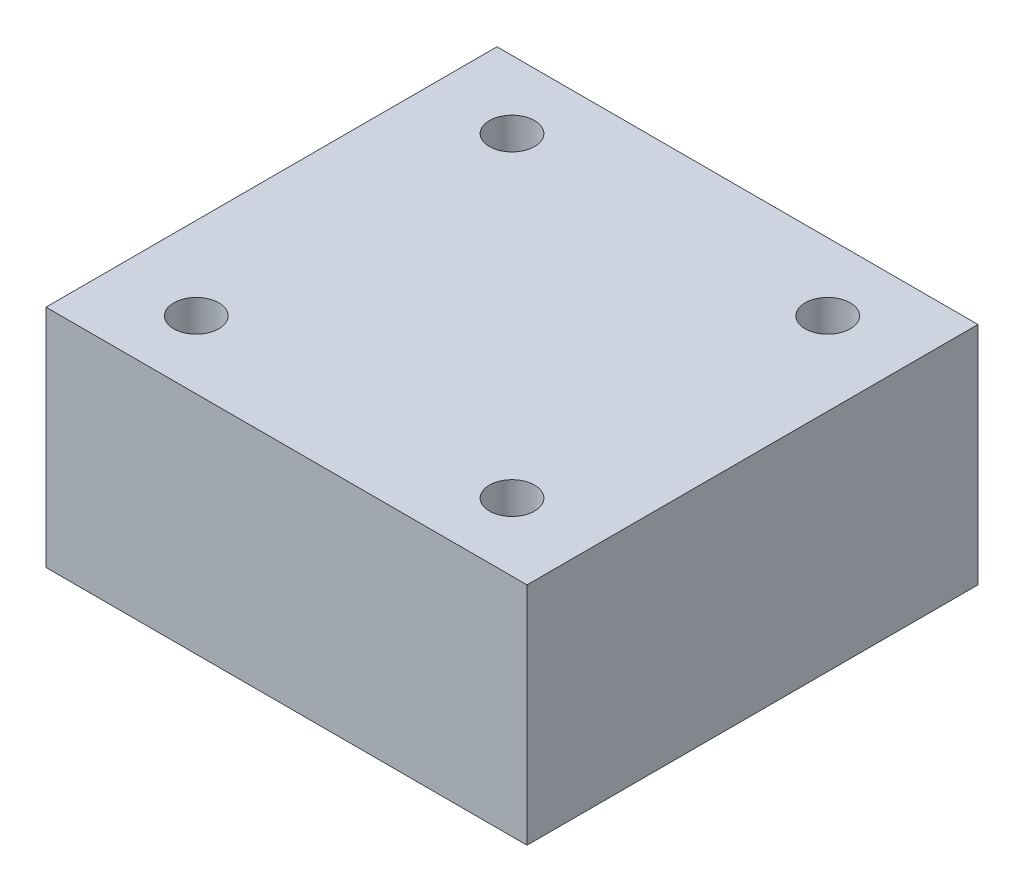
ISO-10303-21;
HEADER;
FILE_DESCRIPTION(('STEP AP214'),'2;1');
FILE_NAME('part.step','',(''),(''),'','','');
FILE_SCHEMA(('AUTOMOTIVE_DESIGN { 1 0 10303 214 1 1 1 1 }'));
ENDSEC;
DATA;
#1=APPLICATION_CONTEXT('core data for automotive mechanical design processes');
#2=APPLICATION_PROTOCOL_DEFINITION('international standard','automotive_design',2000,#1);
#3=PRODUCT_CONTEXT('',#1,'mechanical');
#4=PRODUCT('Part','Part','',(#3));
#5=PRODUCT_RELATED_PRODUCT_CATEGORY('part','',(#4));
#6=PRODUCT_DEFINITION_FORMATION('','',#4);
#7=PRODUCT_DEFINITION_CONTEXT('part definition',#1,'design');
#8=PRODUCT_DEFINITION('design','',#6,#7);
#9=PRODUCT_DEFINITION_SHAPE('','',#8);
#10=(LENGTH_UNIT() NAMED_UNIT(*) SI_UNIT(.MILLI.,.METRE.));
#11=(NAMED_UNIT(*) PLANE_ANGLE_UNIT() SI_UNIT($,.RADIAN.));
#12=(NAMED_UNIT(*) SI_UNIT($,.STERADIAN.) SOLID_ANGLE_UNIT());
#13=UNCERTAINTY_MEASURE_WITH_UNIT(LENGTH_MEASURE(1.E-05),#10,'distance_accuracy_value','');
#14=(GEOMETRIC_REPRESENTATION_CONTEXT(3) GLOBAL_UNCERTAINTY_ASSIGNED_CONTEXT((#13)) GLOBAL_UNIT_ASSIGNED_CONTEXT((#10,
#11,#12)) REPRESENTATION_CONTEXT('',''));
#15=CARTESIAN_POINT('',(0.,0.,0.));
#16=DIRECTION('',(0.,0.,1.));
#17=DIRECTION('',(1.,0.,0.));
#18=AXIS2_PLACEMENT_3D('',#15,#16,#17);
#19=CARTESIAN_POINT('',(0.,15.,0.));
#20=DIRECTION('',(1.,0.,0.));
#21=DIRECTION('',(0.,0.,-1.));
#22=AXIS2_PLACEMENT_3D('',#19,#20,#21);
#23=PLANE('',#22);
#24=DIRECTION('',(0.,0.,1.));
#25=VECTOR('',#24,1.);
#26=CARTESIAN_POINT('',(0.,0.,0.));
#27=LINE('',#26,#25);
#28=CARTESIAN_POINT('',(0.,0.,-30.));
#29=VERTEX_POINT('',#28);
#30=CARTESIAN_POINT('',(0.,0.,0.));
#31=VERTEX_POINT('',#30);
#32=EDGE_CURVE('E115',#29,#31,#27,.T.);
#33=ORIENTED_EDGE('',*,*,#32,.T.);
#34=DIRECTION('',(0.,-1.,0.));
#35=VECTOR('',#34,1.);
#36=CARTESIAN_POINT('',(0.,15.,0.));
#37=LINE('',#36,#35);
#38=CARTESIAN_POINT('',(0.,15.,0.));
#39=VERTEX_POINT('',#38);
#40=EDGE_CURVE('E11',#39,#31,#37,.T.);
#41=ORIENTED_EDGE('',*,*,#40,.F.);
#42=DIRECTION('',(0.,0.,1.));
#43=VECTOR('',#42,1.);
#44=CARTESIAN_POINT('',(0.,15.,0.));
#45=LINE('',#44,#43);
#46=CARTESIAN_POINT('',(0.,15.,-30.));
#47=VERTEX_POINT('',#46);
#48=EDGE_CURVE('E99',#47,#39,#45,.T.);
#49=ORIENTED_EDGE('',*,*,#48,.F.);
#50=DIRECTION('',(0.,-1.,0.));
#51=VECTOR('',#50,1.);
#52=CARTESIAN_POINT('',(0.,15.,-30.));
#53=LINE('',#52,#51);
#54=EDGE_CURVE('E111',#47,#29,#53,.T.);
#55=ORIENTED_EDGE('',*,*,#54,.T.);
#56=EDGE_LOOP('',(#33,#41,#49,#55));
#57=FACE_BOUND('',#56,.T.);
#58=ADVANCED_FACE('F47',(#57),#23,.F.);
#59=CARTESIAN_POINT('',(0.,15.,0.));
#60=DIRECTION('',(0.,0.,-1.));
#61=DIRECTION('',(-1.,0.,0.));
#62=AXIS2_PLACEMENT_3D('',#59,#60,#61);
#63=PLANE('',#62);
#64=DIRECTION('',(1.,0.,0.));
#65=VECTOR('',#64,1.);
#66=CARTESIAN_POINT('',(0.,0.,0.));
#67=LINE('',#66,#65);
#68=CARTESIAN_POINT('',(32.,0.,0.));
#69=VERTEX_POINT('',#68);
#70=EDGE_CURVE('E104',#31,#69,#67,.T.);
#71=ORIENTED_EDGE('',*,*,#70,.T.);
#72=DIRECTION('',(0.,-1.,0.));
#73=VECTOR('',#72,1.);
#74=CARTESIAN_POINT('',(32.,15.,0.));
#75=LINE('',#74,#73);
#76=CARTESIAN_POINT('',(32.,15.,0.));
#77=VERTEX_POINT('',#76);
#78=EDGE_CURVE('E56',#77,#69,#75,.T.);
#79=ORIENTED_EDGE('',*,*,#78,.F.);
#80=DIRECTION('',(1.,0.,0.));
#81=VECTOR('',#80,1.);
#82=CARTESIAN_POINT('',(0.,15.,0.));
#83=LINE('',#82,#81);
#84=EDGE_CURVE('E94',#39,#77,#83,.T.);
#85=ORIENTED_EDGE('',*,*,#84,.F.);
#86=ORIENTED_EDGE('',*,*,#40,.T.);
#87=EDGE_LOOP('',(#71,#79,#85,#86));
#88=FACE_BOUND('',#87,.T.);
#89=ADVANCED_FACE('F103',(#88),#63,.F.);
#90=CARTESIAN_POINT('',(32.,15.,0.));
#91=DIRECTION('',(-1.,0.,0.));
#92=DIRECTION('',(0.,0.,1.));
#93=AXIS2_PLACEMENT_3D('',#90,#91,#92);
#94=PLANE('',#93);
#95=DIRECTION('',(0.,0.,-1.));
#96=VECTOR('',#95,1.);
#97=CARTESIAN_POINT('',(32.,0.,0.));
#98=LINE('',#97,#96);
#99=CARTESIAN_POINT('',(32.,0.,-30.));
#100=VERTEX_POINT('',#99);
#101=EDGE_CURVE('E81',#69,#100,#98,.T.);
#102=ORIENTED_EDGE('',*,*,#101,.T.);
#103=DIRECTION('',(0.,-1.,0.));
#104=VECTOR('',#103,1.);
#105=CARTESIAN_POINT('',(32.,15.,-30.));
#106=LINE('',#105,#104);
#107=CARTESIAN_POINT('',(32.,15.,-30.));
#108=VERTEX_POINT('',#107);
#109=EDGE_CURVE('E106',#108,#100,#106,.T.);
#110=ORIENTED_EDGE('',*,*,#109,.F.);
#111=DIRECTION('',(0.,0.,-1.));
#112=VECTOR('',#111,1.);
#113=CARTESIAN_POINT('',(32.,15.,0.));
#114=LINE('',#113,#112);
#115=EDGE_CURVE('E97',#77,#108,#114,.T.);
#116=ORIENTED_EDGE('',*,*,#115,.F.);
#117=ORIENTED_EDGE('',*,*,#78,.T.);
#118=EDGE_LOOP('',(#102,#110,#116,#117));
#119=FACE_BOUND('',#118,.T.);
#120=ADVANCED_FACE('F107',(#119),#94,.F.);
#121=CARTESIAN_POINT('',(0.,15.,-30.));
#122=DIRECTION('',(0.,0.,1.));
#123=DIRECTION('',(1.,0.,0.));
#124=AXIS2_PLACEMENT_3D('',#121,#122,#123);
#125=PLANE('',#124);
#126=DIRECTION('',(-1.,0.,0.));
#127=VECTOR('',#126,1.);
#128=CARTESIAN_POINT('',(0.,0.,-30.));
#129=LINE('',#128,#127);
#130=EDGE_CURVE('E87',#100,#29,#129,.T.);
#131=ORIENTED_EDGE('',*,*,#130,.T.);
#132=ORIENTED_EDGE('',*,*,#54,.F.);
#133=DIRECTION('',(-1.,0.,0.));
#134=VECTOR('',#133,1.);
#135=CARTESIAN_POINT('',(0.,15.,-30.));
#136=LINE('',#135,#134);
#137=EDGE_CURVE('E64',#108,#47,#136,.T.);
#138=ORIENTED_EDGE('',*,*,#137,.F.);
#139=ORIENTED_EDGE('',*,*,#109,.T.);
#140=EDGE_LOOP('',(#131,#132,#138,#139));
#141=FACE_BOUND('',#140,.T.);
#142=ADVANCED_FACE('F129',(#141),#125,.F.);
#143=CARTESIAN_POINT('',(0.,15.,0.));
#144=DIRECTION('',(0.,-1.,0.));
#145=DIRECTION('',(0.,0.,-1.));
#146=AXIS2_PLACEMENT_3D('',#143,#144,#145);
#147=PLANE('',#146);
#148=CARTESIAN_POINT('',(26.5,15.,-4.5));
#149=DIRECTION('',(0.,1.,0.));
#150=DIRECTION('',(0.,0.,1.));
#151=AXIS2_PLACEMENT_3D('',#148,#149,#150);
#152=CIRCLE('',#151,1.5);
#153=CARTESIAN_POINT('',(26.5,15.,-3.));
#154=VERTEX_POINT('',#153);
#155=EDGE_CURVE('E148',#154,#154,#152,.T.);
#156=ORIENTED_EDGE('',*,*,#155,.F.);
#157=EDGE_LOOP('',(#156));
#158=FACE_BOUND('',#157,.T.);
#159=CARTESIAN_POINT('',(26.5,15.,-25.5));
#160=DIRECTION('',(0.,1.,0.));
#161=DIRECTION('',(0.,0.,1.));
#162=AXIS2_PLACEMENT_3D('',#159,#160,#161);
#163=CIRCLE('',#162,1.5);
#164=CARTESIAN_POINT('',(26.5,15.,-24.));
#165=VERTEX_POINT('',#164);
#166=EDGE_CURVE('E156',#165,#165,#163,.T.);
#167=ORIENTED_EDGE('',*,*,#166,.F.);
#168=EDGE_LOOP('',(#167));
#169=FACE_BOUND('',#168,.T.);
#170=CARTESIAN_POINT('',(5.5,15.,-25.5));
#171=DIRECTION('',(0.,1.,0.));
#172=DIRECTION('',(0.,0.,1.));
#173=AXIS2_PLACEMENT_3D('',#170,#171,#172);
#174=CIRCLE('',#173,1.5);
#175=CARTESIAN_POINT('',(5.5,15.,-24.));
#176=VERTEX_POINT('',#175);
#177=EDGE_CURVE('E140',#176,#176,#174,.T.);
#178=ORIENTED_EDGE('',*,*,#177,.F.);
#179=EDGE_LOOP('',(#178));
#180=FACE_BOUND('',#179,.T.);
#181=CARTESIAN_POINT('',(5.50000000000001,15.,-4.5));
#182=DIRECTION('',(0.,1.,0.));
#183=DIRECTION('',(0.,0.,1.));
#184=AXIS2_PLACEMENT_3D('',#181,#182,#183);
#185=CIRCLE('',#184,1.5);
#186=CARTESIAN_POINT('',(5.50000000000001,15.,-3.));
#187=VERTEX_POINT('',#186);
#188=EDGE_CURVE('E136',#187,#187,#185,.T.);
#189=ORIENTED_EDGE('',*,*,#188,.F.);
#190=EDGE_LOOP('',(#189));
#191=FACE_BOUND('',#190,.T.);
#192=ORIENTED_EDGE('',*,*,#48,.T.);
#193=ORIENTED_EDGE('',*,*,#84,.T.);
#194=ORIENTED_EDGE('',*,*,#115,.T.);
#195=ORIENTED_EDGE('',*,*,#137,.T.);
#196=EDGE_LOOP('',(#192,#193,#194,#195));
#197=FACE_BOUND('',#196,.T.);
#198=ADVANCED_FACE('F95',(#158,#169,#180,#191,#197),#147,.F.);
#199=CARTESIAN_POINT('',(0.,0.,0.));
#200=DIRECTION('',(0.,-1.,0.));
#201=DIRECTION('',(0.,0.,-1.));
#202=AXIS2_PLACEMENT_3D('',#199,#200,#201);
#203=PLANE('',#202);
#204=CARTESIAN_POINT('',(26.5,0.,-4.5));
#205=DIRECTION('',(0.,1.,0.));
#206=DIRECTION('',(0.,0.,1.));
#207=AXIS2_PLACEMENT_3D('',#204,#205,#206);
#208=CIRCLE('',#207,1.5);
#209=CARTESIAN_POINT('',(26.5,0.,-3.));
#210=VERTEX_POINT('',#209);
#211=EDGE_CURVE('E144',#210,#210,#208,.T.);
#212=ORIENTED_EDGE('',*,*,#211,.T.);
#213=EDGE_LOOP('',(#212));
#214=FACE_BOUND('',#213,.T.);
#215=CARTESIAN_POINT('',(26.5,0.,-25.5));
#216=DIRECTION('',(0.,1.,0.));
#217=DIRECTION('',(0.,0.,1.));
#218=AXIS2_PLACEMENT_3D('',#215,#216,#217);
#219=CIRCLE('',#218,1.5);
#220=CARTESIAN_POINT('',(26.5,0.,-24.));
#221=VERTEX_POINT('',#220);
#222=EDGE_CURVE('E152',#221,#221,#219,.T.);
#223=ORIENTED_EDGE('',*,*,#222,.T.);
#224=EDGE_LOOP('',(#223));
#225=FACE_BOUND('',#224,.T.);
#226=CARTESIAN_POINT('',(5.5,0.,-25.5));
#227=DIRECTION('',(0.,1.,0.));
#228=DIRECTION('',(0.,0.,1.));
#229=AXIS2_PLACEMENT_3D('',#226,#227,#228);
#230=CIRCLE('',#229,1.5);
#231=CARTESIAN_POINT('',(5.5,0.,-24.));
#232=VERTEX_POINT('',#231);
#233=EDGE_CURVE('E160',#232,#232,#230,.T.);
#234=ORIENTED_EDGE('',*,*,#233,.T.);
#235=EDGE_LOOP('',(#234));
#236=FACE_BOUND('',#235,.T.);
#237=CARTESIAN_POINT('',(5.50000000000001,0.,-4.5));
#238=DIRECTION('',(0.,1.,0.));
#239=DIRECTION('',(0.,0.,1.));
#240=AXIS2_PLACEMENT_3D('',#237,#238,#239);
#241=CIRCLE('',#240,1.5);
#242=CARTESIAN_POINT('',(5.50000000000001,0.,-3.));
#243=VERTEX_POINT('',#242);
#244=EDGE_CURVE('E119',#243,#243,#241,.T.);
#245=ORIENTED_EDGE('',*,*,#244,.T.);
#246=EDGE_LOOP('',(#245));
#247=FACE_BOUND('',#246,.T.);
#248=ORIENTED_EDGE('',*,*,#32,.F.);
#249=ORIENTED_EDGE('',*,*,#130,.F.);
#250=ORIENTED_EDGE('',*,*,#101,.F.);
#251=ORIENTED_EDGE('',*,*,#70,.F.);
#252=EDGE_LOOP('',(#248,#249,#250,#251));
#253=FACE_BOUND('',#252,.T.);
#254=ADVANCED_FACE('F132',(#214,#225,#236,#247,#253),#203,.T.);
#255=CARTESIAN_POINT('',(5.50000000000001,0.,-4.5));
#256=DIRECTION('',(0.,1.,0.));
#257=DIRECTION('',(0.,0.,1.));
#258=AXIS2_PLACEMENT_3D('',#255,#256,#257);
#259=CYLINDRICAL_SURFACE('',#258,1.5);
#260=ORIENTED_EDGE('',*,*,#244,.F.);
#261=EDGE_LOOP('',(#260));
#262=FACE_BOUND('',#261,.T.);
#263=ORIENTED_EDGE('',*,*,#188,.T.);
#264=EDGE_LOOP('',(#263));
#265=FACE_BOUND('',#264,.T.);
#266=ADVANCED_FACE('F176',(#262,#265),#259,.F.);
#267=CARTESIAN_POINT('',(5.5,0.,-25.5));
#268=DIRECTION('',(0.,1.,0.));
#269=DIRECTION('',(0.,0.,1.));
#270=AXIS2_PLACEMENT_3D('',#267,#268,#269);
#271=CYLINDRICAL_SURFACE('',#270,1.5);
#272=ORIENTED_EDGE('',*,*,#233,.F.);
#273=EDGE_LOOP('',(#272));
#274=FACE_BOUND('',#273,.T.);
#275=ORIENTED_EDGE('',*,*,#177,.T.);
#276=EDGE_LOOP('',(#275));
#277=FACE_BOUND('',#276,.T.);
#278=ADVANCED_FACE('F168',(#274,#277),#271,.F.);
#279=CARTESIAN_POINT('',(26.5,0.,-25.5));
#280=DIRECTION('',(0.,1.,0.));
#281=DIRECTION('',(0.,0.,1.));
#282=AXIS2_PLACEMENT_3D('',#279,#280,#281);
#283=CYLINDRICAL_SURFACE('',#282,1.5);
#284=ORIENTED_EDGE('',*,*,#222,.F.);
#285=EDGE_LOOP('',(#284));
#286=FACE_BOUND('',#285,.T.);
#287=ORIENTED_EDGE('',*,*,#166,.T.);
#288=EDGE_LOOP('',(#287));
#289=FACE_BOUND('',#288,.T.);
#290=ADVANCED_FACE('F184',(#286,#289),#283,.F.);
#291=CARTESIAN_POINT('',(26.5,0.,-4.5));
#292=DIRECTION('',(0.,1.,0.));
#293=DIRECTION('',(0.,0.,1.));
#294=AXIS2_PLACEMENT_3D('',#291,#292,#293);
#295=CYLINDRICAL_SURFACE('',#294,1.5);
#296=ORIENTED_EDGE('',*,*,#211,.F.);
#297=EDGE_LOOP('',(#296));
#298=FACE_BOUND('',#297,.T.);
#299=ORIENTED_EDGE('',*,*,#155,.T.);
#300=EDGE_LOOP('',(#299));
#301=FACE_BOUND('',#300,.T.);
#302=ADVANCED_FACE('F235',(#298,#301),#295,.F.);
#303=CLOSED_SHELL('',(#58,#89,#120,#142,#198,#254,#266,#278,#290,#302));
#304=MANIFOLD_SOLID_BREP('B2',#303);
#305=ADVANCED_BREP_SHAPE_REPRESENTATION('',(#18,#304),#14);
#306=SHAPE_DEFINITION_REPRESENTATION(#9,#305);
ENDSEC;
END-ISO-10303-21;
